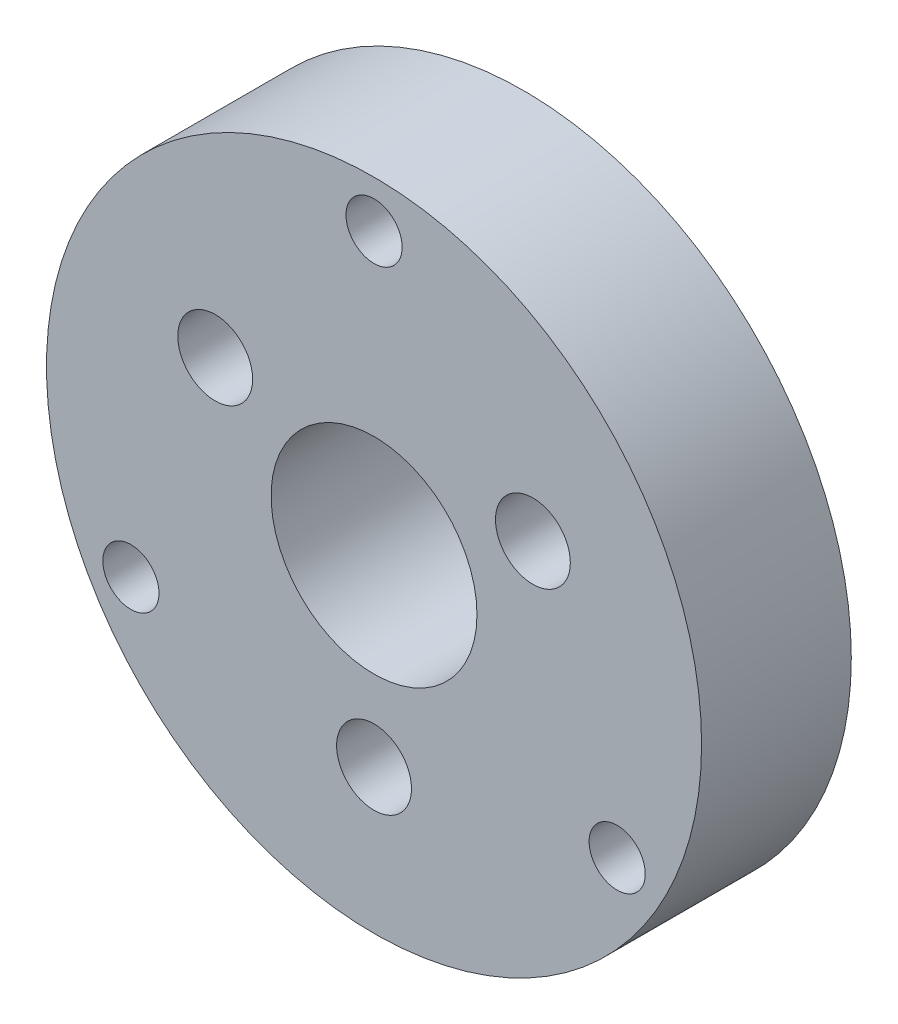
ISO-10303-21;
HEADER;
FILE_DESCRIPTION(('STEP AP214'),'2;1');
FILE_NAME('part.step','',(''),(''),'','','');
FILE_SCHEMA(('AUTOMOTIVE_DESIGN { 1 0 10303 214 1 1 1 1 }'));
ENDSEC;
DATA;
#1=APPLICATION_CONTEXT('core data for automotive mechanical design processes');
#2=APPLICATION_PROTOCOL_DEFINITION('international standard','automotive_design',2000,#1);
#3=PRODUCT_CONTEXT('',#1,'mechanical');
#4=PRODUCT('Part','Part','',(#3));
#5=PRODUCT_RELATED_PRODUCT_CATEGORY('part','',(#4));
#6=PRODUCT_DEFINITION_FORMATION('','',#4);
#7=PRODUCT_DEFINITION_CONTEXT('part definition',#1,'design');
#8=PRODUCT_DEFINITION('design','',#6,#7);
#9=PRODUCT_DEFINITION_SHAPE('','',#8);
#10=(LENGTH_UNIT() NAMED_UNIT(*) SI_UNIT(.MILLI.,.METRE.));
#11=(NAMED_UNIT(*) PLANE_ANGLE_UNIT() SI_UNIT($,.RADIAN.));
#12=(NAMED_UNIT(*) SI_UNIT($,.STERADIAN.) SOLID_ANGLE_UNIT());
#13=UNCERTAINTY_MEASURE_WITH_UNIT(LENGTH_MEASURE(1.E-05),#10,'distance_accuracy_value','');
#14=(GEOMETRIC_REPRESENTATION_CONTEXT(3) GLOBAL_UNCERTAINTY_ASSIGNED_CONTEXT((#13)) GLOBAL_UNIT_ASSIGNED_CONTEXT((#10,
#11,#12)) REPRESENTATION_CONTEXT('',''));
#15=CARTESIAN_POINT('',(0.,0.,0.));
#16=DIRECTION('',(0.,0.,1.));
#17=DIRECTION('',(1.,0.,0.));
#18=AXIS2_PLACEMENT_3D('',#15,#16,#17);
#19=CARTESIAN_POINT('',(0.,0.,8.));
#20=DIRECTION('',(0.,0.,1.));
#21=DIRECTION('',(1.,0.,0.));
#22=AXIS2_PLACEMENT_3D('',#19,#20,#21);
#23=PLANE('',#22);
#24=CARTESIAN_POINT('',(8.48704895708752,4.90000000000059,8.));
#25=DIRECTION('',(0.,0.,1.));
#26=DIRECTION('',(1.,0.,0.));
#27=AXIS2_PLACEMENT_3D('',#24,#25,#26);
#28=CIRCLE('',#27,2.);
#29=CARTESIAN_POINT('',(10.4870489570875,4.90000000000059,8.));
#30=VERTEX_POINT('',#29);
#31=EDGE_CURVE('E74',#30,#30,#28,.F.);
#32=ORIENTED_EDGE('',*,*,#31,.T.);
#33=EDGE_LOOP('',(#32));
#34=FACE_BOUND('',#33,.T.);
#35=CARTESIAN_POINT('',(-12.9903810567656,-7.50000000000056,8.));
#36=DIRECTION('',(0.,0.,1.));
#37=DIRECTION('',(1.,0.,0.));
#38=AXIS2_PLACEMENT_3D('',#35,#36,#37);
#39=CIRCLE('',#38,1.50000000000122);
#40=CARTESIAN_POINT('',(-11.4903810567644,-7.50000000000056,8.));
#41=VERTEX_POINT('',#40);
#42=EDGE_CURVE('E60',#41,#41,#39,.T.);
#43=ORIENTED_EDGE('',*,*,#42,.F.);
#44=EDGE_LOOP('',(#43));
#45=FACE_BOUND('',#44,.T.);
#46=CARTESIAN_POINT('',(0.,0.,8.));
#47=DIRECTION('',(0.,0.,1.));
#48=DIRECTION('',(1.,0.,0.));
#49=AXIS2_PLACEMENT_3D('',#46,#47,#48);
#50=CIRCLE('',#49,5.5);
#51=CARTESIAN_POINT('',(5.5,0.,8.));
#52=VERTEX_POINT('',#51);
#53=EDGE_CURVE('E48',#52,#52,#50,.T.);
#54=ORIENTED_EDGE('',*,*,#53,.F.);
#55=EDGE_LOOP('',(#54));
#56=FACE_BOUND('',#55,.T.);
#57=CARTESIAN_POINT('',(0.,0.,8.));
#58=DIRECTION('',(0.,0.,1.));
#59=DIRECTION('',(1.,0.,0.));
#60=AXIS2_PLACEMENT_3D('',#57,#58,#59);
#61=CIRCLE('',#60,17.5);
#62=CARTESIAN_POINT('',(17.5,0.,8.));
#63=VERTEX_POINT('',#62);
#64=EDGE_CURVE('E10',#63,#63,#61,.T.);
#65=ORIENTED_EDGE('',*,*,#64,.T.);
#66=EDGE_LOOP('',(#65));
#67=FACE_BOUND('',#66,.T.);
#68=CARTESIAN_POINT('',(0.,15.,8.));
#69=DIRECTION('',(0.,0.,1.));
#70=DIRECTION('',(1.,0.,0.));
#71=AXIS2_PLACEMENT_3D('',#68,#69,#70);
#72=CIRCLE('',#71,1.5);
#73=CARTESIAN_POINT('',(1.5,15.,8.));
#74=VERTEX_POINT('',#73);
#75=EDGE_CURVE('E43',#74,#74,#72,.T.);
#76=ORIENTED_EDGE('',*,*,#75,.F.);
#77=EDGE_LOOP('',(#76));
#78=FACE_BOUND('',#77,.T.);
#79=CARTESIAN_POINT('',(12.9903810567675,-7.49999999999944,8.));
#80=DIRECTION('',(0.,0.,1.));
#81=DIRECTION('',(1.,0.,0.));
#82=AXIS2_PLACEMENT_3D('',#79,#80,#81);
#83=CIRCLE('',#82,1.50000000000082);
#84=CARTESIAN_POINT('',(14.4903810567684,-7.49999999999944,8.));
#85=VERTEX_POINT('',#84);
#86=EDGE_CURVE('E54',#85,#85,#83,.T.);
#87=ORIENTED_EDGE('',*,*,#86,.F.);
#88=EDGE_LOOP('',(#87));
#89=FACE_BOUND('',#88,.T.);
#90=CARTESIAN_POINT('',(-8.48704895708748,4.90000000000004,8.));
#91=DIRECTION('',(0.,0.,1.));
#92=DIRECTION('',(1.,0.,0.));
#93=AXIS2_PLACEMENT_3D('',#90,#91,#92);
#94=CIRCLE('',#93,2.);
#95=CARTESIAN_POINT('',(-6.48704895708748,4.90000000000004,8.));
#96=VERTEX_POINT('',#95);
#97=EDGE_CURVE('E66',#96,#96,#94,.F.);
#98=ORIENTED_EDGE('',*,*,#97,.T.);
#99=EDGE_LOOP('',(#98));
#100=FACE_BOUND('',#99,.T.);
#101=CARTESIAN_POINT('',(4.9789781200289E-13,-9.79999999999969,8.));
#102=DIRECTION('',(0.,0.,1.));
#103=DIRECTION('',(1.,0.,0.));
#104=AXIS2_PLACEMENT_3D('',#101,#102,#103);
#105=CIRCLE('',#104,2.);
#106=CARTESIAN_POINT('',(2.0000000000005,-9.79999999999969,8.));
#107=VERTEX_POINT('',#106);
#108=EDGE_CURVE('E80',#107,#107,#105,.F.);
#109=ORIENTED_EDGE('',*,*,#108,.T.);
#110=EDGE_LOOP('',(#109));
#111=FACE_BOUND('',#110,.T.);
#112=ADVANCED_FACE('F32',(#34,#45,#56,#67,#78,#89,#100,#111),#23,.T.);
#113=CARTESIAN_POINT('',(0.,0.,0.));
#114=DIRECTION('',(0.,0.,1.));
#115=DIRECTION('',(1.,0.,0.));
#116=AXIS2_PLACEMENT_3D('',#113,#114,#115);
#117=PLANE('',#116);
#118=CARTESIAN_POINT('',(8.48704895708752,4.90000000000059,0.));
#119=DIRECTION('',(0.,0.,1.));
#120=DIRECTION('',(1.,0.,0.));
#121=AXIS2_PLACEMENT_3D('',#118,#119,#120);
#122=CIRCLE('',#121,2.);
#123=CARTESIAN_POINT('',(10.4870489570875,4.90000000000059,0.));
#124=VERTEX_POINT('',#123);
#125=EDGE_CURVE('E77',#124,#124,#122,.T.);
#126=ORIENTED_EDGE('',*,*,#125,.T.);
#127=EDGE_LOOP('',(#126));
#128=FACE_BOUND('',#127,.T.);
#129=CARTESIAN_POINT('',(-12.9903810567656,-7.50000000000056,0.));
#130=DIRECTION('',(0.,0.,1.));
#131=DIRECTION('',(1.,0.,0.));
#132=AXIS2_PLACEMENT_3D('',#129,#130,#131);
#133=CIRCLE('',#132,1.50000000000122);
#134=CARTESIAN_POINT('',(-11.4903810567644,-7.50000000000056,0.));
#135=VERTEX_POINT('',#134);
#136=EDGE_CURVE('E63',#135,#135,#133,.T.);
#137=ORIENTED_EDGE('',*,*,#136,.T.);
#138=EDGE_LOOP('',(#137));
#139=FACE_BOUND('',#138,.T.);
#140=CARTESIAN_POINT('',(0.,0.,0.));
#141=DIRECTION('',(0.,0.,1.));
#142=DIRECTION('',(1.,0.,0.));
#143=AXIS2_PLACEMENT_3D('',#140,#141,#142);
#144=CIRCLE('',#143,5.5);
#145=CARTESIAN_POINT('',(5.5,0.,0.));
#146=VERTEX_POINT('',#145);
#147=EDGE_CURVE('E51',#146,#146,#144,.T.);
#148=ORIENTED_EDGE('',*,*,#147,.T.);
#149=EDGE_LOOP('',(#148));
#150=FACE_BOUND('',#149,.T.);
#151=CARTESIAN_POINT('',(0.,0.,0.));
#152=DIRECTION('',(0.,0.,1.));
#153=DIRECTION('',(1.,0.,0.));
#154=AXIS2_PLACEMENT_3D('',#151,#152,#153);
#155=CIRCLE('',#154,17.5);
#156=CARTESIAN_POINT('',(17.5,0.,0.));
#157=VERTEX_POINT('',#156);
#158=EDGE_CURVE('E36',#157,#157,#155,.T.);
#159=ORIENTED_EDGE('',*,*,#158,.F.);
#160=EDGE_LOOP('',(#159));
#161=FACE_BOUND('',#160,.T.);
#162=CARTESIAN_POINT('',(0.,15.,0.));
#163=DIRECTION('',(0.,0.,1.));
#164=DIRECTION('',(1.,0.,0.));
#165=AXIS2_PLACEMENT_3D('',#162,#163,#164);
#166=CIRCLE('',#165,1.5);
#167=CARTESIAN_POINT('',(1.5,15.,0.));
#168=VERTEX_POINT('',#167);
#169=EDGE_CURVE('E45',#168,#168,#166,.T.);
#170=ORIENTED_EDGE('',*,*,#169,.T.);
#171=EDGE_LOOP('',(#170));
#172=FACE_BOUND('',#171,.T.);
#173=CARTESIAN_POINT('',(12.9903810567675,-7.49999999999944,0.));
#174=DIRECTION('',(0.,0.,1.));
#175=DIRECTION('',(1.,0.,0.));
#176=AXIS2_PLACEMENT_3D('',#173,#174,#175);
#177=CIRCLE('',#176,1.50000000000082);
#178=CARTESIAN_POINT('',(14.4903810567684,-7.49999999999944,0.));
#179=VERTEX_POINT('',#178);
#180=EDGE_CURVE('E57',#179,#179,#177,.T.);
#181=ORIENTED_EDGE('',*,*,#180,.T.);
#182=EDGE_LOOP('',(#181));
#183=FACE_BOUND('',#182,.T.);
#184=CARTESIAN_POINT('',(-8.48704895708748,4.90000000000004,0.));
#185=DIRECTION('',(0.,0.,1.));
#186=DIRECTION('',(1.,0.,0.));
#187=AXIS2_PLACEMENT_3D('',#184,#185,#186);
#188=CIRCLE('',#187,2.);
#189=CARTESIAN_POINT('',(-6.48704895708748,4.90000000000004,0.));
#190=VERTEX_POINT('',#189);
#191=EDGE_CURVE('E71',#190,#190,#188,.T.);
#192=ORIENTED_EDGE('',*,*,#191,.T.);
#193=EDGE_LOOP('',(#192));
#194=FACE_BOUND('',#193,.T.);
#195=CARTESIAN_POINT('',(4.9789781200289E-13,-9.79999999999969,0.));
#196=DIRECTION('',(0.,0.,1.));
#197=DIRECTION('',(1.,0.,0.));
#198=AXIS2_PLACEMENT_3D('',#195,#196,#197);
#199=CIRCLE('',#198,2.);
#200=CARTESIAN_POINT('',(2.0000000000005,-9.79999999999969,0.));
#201=VERTEX_POINT('',#200);
#202=EDGE_CURVE('E83',#201,#201,#199,.T.);
#203=ORIENTED_EDGE('',*,*,#202,.T.);
#204=EDGE_LOOP('',(#203));
#205=FACE_BOUND('',#204,.T.);
#206=ADVANCED_FACE('F87',(#128,#139,#150,#161,#172,#183,#194,#205),#117,.F.);
#207=CARTESIAN_POINT('',(0.,0.,8.));
#208=DIRECTION('',(0.,0.,-1.));
#209=DIRECTION('',(-1.,0.,0.));
#210=AXIS2_PLACEMENT_3D('',#207,#208,#209);
#211=CYLINDRICAL_SURFACE('',#210,17.5);
#212=ORIENTED_EDGE('',*,*,#64,.F.);
#213=EDGE_LOOP('',(#212));
#214=FACE_BOUND('',#213,.T.);
#215=ORIENTED_EDGE('',*,*,#158,.T.);
#216=EDGE_LOOP('',(#215));
#217=FACE_BOUND('',#216,.T.);
#218=ADVANCED_FACE('F34',(#214,#217),#211,.T.);
#219=CARTESIAN_POINT('',(0.,15.,8.));
#220=DIRECTION('',(0.,0.,-1.));
#221=DIRECTION('',(-1.,0.,0.));
#222=AXIS2_PLACEMENT_3D('',#219,#220,#221);
#223=CYLINDRICAL_SURFACE('',#222,1.5);
#224=ORIENTED_EDGE('',*,*,#75,.T.);
#225=EDGE_LOOP('',(#224));
#226=FACE_BOUND('',#225,.T.);
#227=ORIENTED_EDGE('',*,*,#169,.F.);
#228=EDGE_LOOP('',(#227));
#229=FACE_BOUND('',#228,.T.);
#230=ADVANCED_FACE('F110',(#226,#229),#223,.F.);
#231=CARTESIAN_POINT('',(0.,0.,8.));
#232=DIRECTION('',(0.,0.,-1.));
#233=DIRECTION('',(-1.,0.,0.));
#234=AXIS2_PLACEMENT_3D('',#231,#232,#233);
#235=CYLINDRICAL_SURFACE('',#234,5.5);
#236=ORIENTED_EDGE('',*,*,#53,.T.);
#237=EDGE_LOOP('',(#236));
#238=FACE_BOUND('',#237,.T.);
#239=ORIENTED_EDGE('',*,*,#147,.F.);
#240=EDGE_LOOP('',(#239));
#241=FACE_BOUND('',#240,.T.);
#242=ADVANCED_FACE('F113',(#238,#241),#235,.F.);
#243=CARTESIAN_POINT('',(12.9903810567675,-7.49999999999944,8.));
#244=DIRECTION('',(0.,0.,-1.));
#245=DIRECTION('',(-1.,0.,0.));
#246=AXIS2_PLACEMENT_3D('',#243,#244,#245);
#247=CYLINDRICAL_SURFACE('',#246,1.50000000000082);
#248=ORIENTED_EDGE('',*,*,#86,.T.);
#249=EDGE_LOOP('',(#248));
#250=FACE_BOUND('',#249,.T.);
#251=ORIENTED_EDGE('',*,*,#180,.F.);
#252=EDGE_LOOP('',(#251));
#253=FACE_BOUND('',#252,.T.);
#254=ADVANCED_FACE('F117',(#250,#253),#247,.F.);
#255=CARTESIAN_POINT('',(-12.9903810567656,-7.50000000000056,8.));
#256=DIRECTION('',(0.,0.,-1.));
#257=DIRECTION('',(-1.,0.,0.));
#258=AXIS2_PLACEMENT_3D('',#255,#256,#257);
#259=CYLINDRICAL_SURFACE('',#258,1.50000000000122);
#260=ORIENTED_EDGE('',*,*,#42,.T.);
#261=EDGE_LOOP('',(#260));
#262=FACE_BOUND('',#261,.T.);
#263=ORIENTED_EDGE('',*,*,#136,.F.);
#264=EDGE_LOOP('',(#263));
#265=FACE_BOUND('',#264,.T.);
#266=ADVANCED_FACE('F121',(#262,#265),#259,.F.);
#267=CARTESIAN_POINT('',(-8.48704895708748,4.90000000000004,19.));
#268=DIRECTION('',(0.,0.,-1.));
#269=DIRECTION('',(-1.,0.,0.));
#270=AXIS2_PLACEMENT_3D('',#267,#268,#269);
#271=CYLINDRICAL_SURFACE('',#270,2.);
#272=ORIENTED_EDGE('',*,*,#97,.F.);
#273=EDGE_LOOP('',(#272));
#274=FACE_BOUND('',#273,.T.);
#275=ORIENTED_EDGE('',*,*,#191,.F.);
#276=EDGE_LOOP('',(#275));
#277=FACE_BOUND('',#276,.T.);
#278=ADVANCED_FACE('F97',(#274,#277),#271,.F.);
#279=CARTESIAN_POINT('',(8.48704895708752,4.90000000000059,19.));
#280=DIRECTION('',(0.,0.,-1.));
#281=DIRECTION('',(-1.,0.,0.));
#282=AXIS2_PLACEMENT_3D('',#279,#280,#281);
#283=CYLINDRICAL_SURFACE('',#282,2.);
#284=ORIENTED_EDGE('',*,*,#31,.F.);
#285=EDGE_LOOP('',(#284));
#286=FACE_BOUND('',#285,.T.);
#287=ORIENTED_EDGE('',*,*,#125,.F.);
#288=EDGE_LOOP('',(#287));
#289=FACE_BOUND('',#288,.T.);
#290=ADVANCED_FACE('F91',(#286,#289),#283,.F.);
#291=CARTESIAN_POINT('',(4.9789781200289E-13,-9.79999999999969,19.));
#292=DIRECTION('',(0.,0.,-1.));
#293=DIRECTION('',(-1.,0.,0.));
#294=AXIS2_PLACEMENT_3D('',#291,#292,#293);
#295=CYLINDRICAL_SURFACE('',#294,2.);
#296=ORIENTED_EDGE('',*,*,#108,.F.);
#297=EDGE_LOOP('',(#296));
#298=FACE_BOUND('',#297,.T.);
#299=ORIENTED_EDGE('',*,*,#202,.F.);
#300=EDGE_LOOP('',(#299));
#301=FACE_BOUND('',#300,.T.);
#302=ADVANCED_FACE('F89',(#298,#301),#295,.F.);
#303=CLOSED_SHELL('',(#112,#206,#218,#230,#242,#254,#266,#278,#290,#302));
#304=MANIFOLD_SOLID_BREP('B2',#303);
#305=ADVANCED_BREP_SHAPE_REPRESENTATION('',(#18,#304),#14);
#306=SHAPE_DEFINITION_REPRESENTATION(#9,#305);
ENDSEC;
END-ISO-10303-21;
